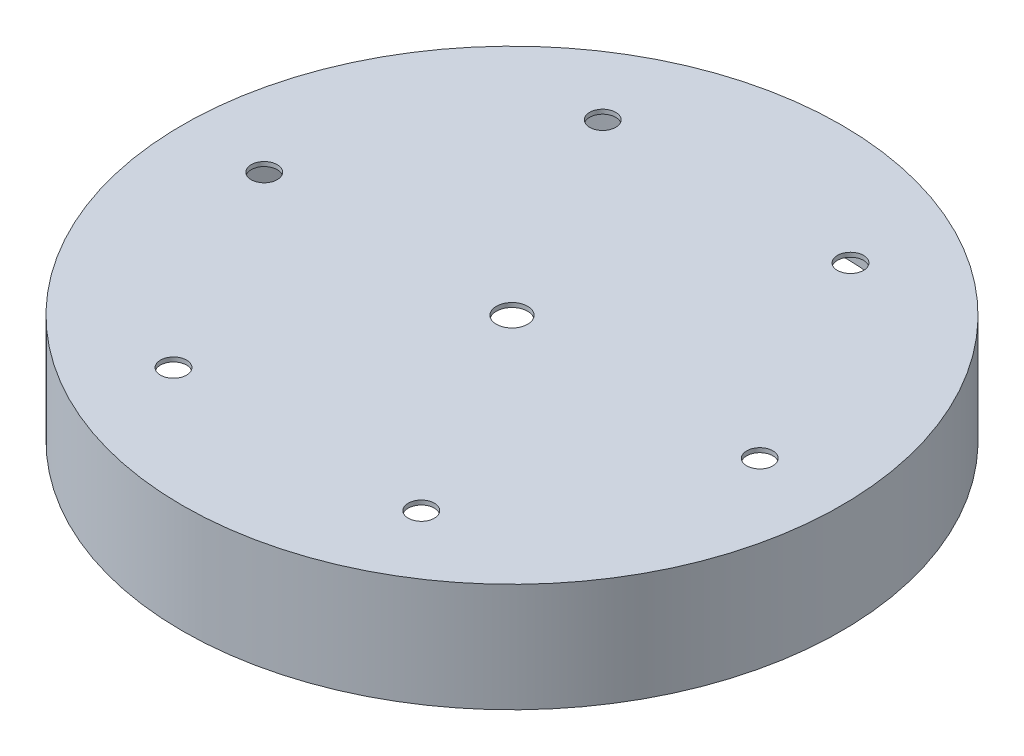
ISO-10303-21;
HEADER;
FILE_DESCRIPTION(('STEP AP214'),'2;1');
FILE_NAME('part.step','',(''),(''),'','','');
FILE_SCHEMA(('AUTOMOTIVE_DESIGN { 1 0 10303 214 1 1 1 1 }'));
ENDSEC;
DATA;
#1=APPLICATION_CONTEXT('core data for automotive mechanical design processes');
#2=APPLICATION_PROTOCOL_DEFINITION('international standard','automotive_design',2000,#1);
#3=PRODUCT_CONTEXT('',#1,'mechanical');
#4=PRODUCT('Part','Part','',(#3));
#5=PRODUCT_RELATED_PRODUCT_CATEGORY('part','',(#4));
#6=PRODUCT_DEFINITION_FORMATION('','',#4);
#7=PRODUCT_DEFINITION_CONTEXT('part definition',#1,'design');
#8=PRODUCT_DEFINITION('design','',#6,#7);
#9=PRODUCT_DEFINITION_SHAPE('','',#8);
#10=(LENGTH_UNIT() NAMED_UNIT(*) SI_UNIT(.MILLI.,.METRE.));
#11=(NAMED_UNIT(*) PLANE_ANGLE_UNIT() SI_UNIT($,.RADIAN.));
#12=(NAMED_UNIT(*) SI_UNIT($,.STERADIAN.) SOLID_ANGLE_UNIT());
#13=UNCERTAINTY_MEASURE_WITH_UNIT(LENGTH_MEASURE(1.E-05),#10,'distance_accuracy_value','');
#14=(GEOMETRIC_REPRESENTATION_CONTEXT(3) GLOBAL_UNCERTAINTY_ASSIGNED_CONTEXT((#13)) GLOBAL_UNIT_ASSIGNED_CONTEXT((#10,
#11,#12)) REPRESENTATION_CONTEXT('',''));
#15=CARTESIAN_POINT('',(0.,0.,0.));
#16=DIRECTION('',(0.,0.,1.));
#17=DIRECTION('',(1.,0.,0.));
#18=AXIS2_PLACEMENT_3D('',#15,#16,#17);
#19=CARTESIAN_POINT('',(0.,31.75,0.));
#20=DIRECTION('',(0.,-1.,0.));
#21=DIRECTION('',(0.,0.,-1.));
#22=AXIS2_PLACEMENT_3D('',#19,#20,#21);
#23=CYLINDRICAL_SURFACE('',#22,96.266);
#24=CARTESIAN_POINT('',(0.,31.75,0.));
#25=DIRECTION('',(0.,1.,0.));
#26=DIRECTION('',(0.,0.,1.));
#27=AXIS2_PLACEMENT_3D('',#24,#25,#26);
#28=CIRCLE('',#27,96.266);
#29=CARTESIAN_POINT('',(0.,31.75,96.266));
#30=VERTEX_POINT('',#29);
#31=EDGE_CURVE('E10',#30,#30,#28,.T.);
#32=ORIENTED_EDGE('',*,*,#31,.F.);
#33=EDGE_LOOP('',(#32));
#34=FACE_BOUND('',#33,.T.);
#35=CARTESIAN_POINT('',(0.,0.,0.));
#36=DIRECTION('',(0.,1.,0.));
#37=DIRECTION('',(0.,0.,1.));
#38=AXIS2_PLACEMENT_3D('',#35,#36,#37);
#39=CIRCLE('',#38,96.266);
#40=CARTESIAN_POINT('',(0.,0.,96.266));
#41=VERTEX_POINT('',#40);
#42=EDGE_CURVE('E38',#41,#41,#39,.T.);
#43=ORIENTED_EDGE('',*,*,#42,.T.);
#44=EDGE_LOOP('',(#43));
#45=FACE_BOUND('',#44,.T.);
#46=ADVANCED_FACE('F31',(#34,#45),#23,.T.);
#47=CARTESIAN_POINT('',(0.,31.75,0.));
#48=DIRECTION('',(0.,1.,0.));
#49=DIRECTION('',(0.,0.,1.));
#50=AXIS2_PLACEMENT_3D('',#47,#48,#49);
#51=PLANE('',#50);
#52=CARTESIAN_POINT('',(72.3821248370096,31.75,-2.03081109092303E-12));
#53=DIRECTION('',(0.,1.,0.));
#54=DIRECTION('',(0.,0.,1.));
#55=AXIS2_PLACEMENT_3D('',#52,#53,#54);
#56=CIRCLE('',#55,3.81000000000073);
#57=CARTESIAN_POINT('',(72.3821248370096,31.75,3.8099999999987));
#58=VERTEX_POINT('',#57);
#59=EDGE_CURVE('E53',#58,#58,#56,.T.);
#60=ORIENTED_EDGE('',*,*,#59,.F.);
#61=EDGE_LOOP('',(#60));
#62=FACE_BOUND('',#61,.T.);
#63=CARTESIAN_POINT('',(36.1910624185041,31.75,62.684758888746));
#64=DIRECTION('',(0.,1.,0.));
#65=DIRECTION('',(0.,0.,1.));
#66=AXIS2_PLACEMENT_3D('',#63,#64,#65);
#67=CIRCLE('',#66,3.80999999999896);
#68=CARTESIAN_POINT('',(36.1910624185041,31.75,66.4947588887449));
#69=VERTEX_POINT('',#68);
#70=EDGE_CURVE('E148',#69,#69,#67,.T.);
#71=ORIENTED_EDGE('',*,*,#70,.F.);
#72=EDGE_LOOP('',(#71));
#73=FACE_BOUND('',#72,.T.);
#74=CARTESIAN_POINT('',(-36.1910624185056,31.75,62.6847588887465));
#75=DIRECTION('',(0.,1.,0.));
#76=DIRECTION('',(0.,0.,1.));
#77=AXIS2_PLACEMENT_3D('',#74,#75,#76);
#78=CIRCLE('',#77,3.81);
#79=CARTESIAN_POINT('',(-36.1910624185056,31.75,66.4947588887465));
#80=VERTEX_POINT('',#79);
#81=EDGE_CURVE('E77',#80,#80,#78,.T.);
#82=ORIENTED_EDGE('',*,*,#81,.F.);
#83=EDGE_LOOP('',(#82));
#84=FACE_BOUND('',#83,.T.);
#85=CARTESIAN_POINT('',(-72.3821248370104,31.75,-1.71390679426509E-12));
#86=DIRECTION('',(0.,1.,0.));
#87=DIRECTION('',(0.,0.,1.));
#88=AXIS2_PLACEMENT_3D('',#85,#86,#87);
#89=CIRCLE('',#88,3.81000000000016);
#90=CARTESIAN_POINT('',(-72.3821248370104,31.75,3.80999999999845));
#91=VERTEX_POINT('',#90);
#92=EDGE_CURVE('E152',#91,#91,#89,.T.);
#93=ORIENTED_EDGE('',*,*,#92,.F.);
#94=EDGE_LOOP('',(#93));
#95=FACE_BOUND('',#94,.T.);
#96=CARTESIAN_POINT('',(-36.1910624185062,31.75,-62.6847588887486));
#97=DIRECTION('',(0.,1.,0.));
#98=DIRECTION('',(0.,0.,1.));
#99=AXIS2_PLACEMENT_3D('',#96,#97,#98);
#100=CIRCLE('',#99,3.81000000000217);
#101=CARTESIAN_POINT('',(-36.1910624185062,31.75,-58.8747588887464));
#102=VERTEX_POINT('',#101);
#103=EDGE_CURVE('E145',#102,#102,#100,.T.);
#104=ORIENTED_EDGE('',*,*,#103,.F.);
#105=EDGE_LOOP('',(#104));
#106=FACE_BOUND('',#105,.T.);
#107=CARTESIAN_POINT('',(36.1910624185039,31.75,-62.6847588887484));
#108=DIRECTION('',(0.,1.,0.));
#109=DIRECTION('',(0.,0.,1.));
#110=AXIS2_PLACEMENT_3D('',#107,#108,#109);
#111=CIRCLE('',#110,3.81000000000135);
#112=CARTESIAN_POINT('',(36.1910624185039,31.75,-58.8747588887471));
#113=VERTEX_POINT('',#112);
#114=EDGE_CURVE('E142',#113,#113,#111,.T.);
#115=ORIENTED_EDGE('',*,*,#114,.F.);
#116=EDGE_LOOP('',(#115));
#117=FACE_BOUND('',#116,.T.);
#118=CARTESIAN_POINT('',(1.162989650898E-06,31.75,-2.51670172484532E-06));
#119=DIRECTION('',(0.,1.,0.));
#120=DIRECTION('',(0.,0.,1.));
#121=AXIS2_PLACEMENT_3D('',#118,#119,#120);
#122=CIRCLE('',#121,4.564126);
#123=CARTESIAN_POINT('',(1.162989650898E-06,31.75,4.56412348329828));
#124=VERTEX_POINT('',#123);
#125=EDGE_CURVE('E66',#124,#124,#122,.T.);
#126=ORIENTED_EDGE('',*,*,#125,.F.);
#127=EDGE_LOOP('',(#126));
#128=FACE_BOUND('',#127,.T.);
#129=ORIENTED_EDGE('',*,*,#31,.T.);
#130=EDGE_LOOP('',(#129));
#131=FACE_BOUND('',#130,.T.);
#132=ADVANCED_FACE('F90',(#62,#73,#84,#95,#106,#117,#128,#131),#51,.T.);
#133=CARTESIAN_POINT('',(0.,0.,0.));
#134=DIRECTION('',(0.,1.,0.));
#135=DIRECTION('',(0.,0.,1.));
#136=AXIS2_PLACEMENT_3D('',#133,#134,#135);
#137=PLANE('',#136);
#138=CARTESIAN_POINT('',(0.,0.,0.));
#139=DIRECTION('',(0.,-1.,0.));
#140=DIRECTION('',(0.,0.,-1.));
#141=AXIS2_PLACEMENT_3D('',#138,#139,#140);
#142=CIRCLE('',#141,94.996);
#143=CARTESIAN_POINT('',(0.,0.,-94.996));
#144=VERTEX_POINT('',#143);
#145=EDGE_CURVE('E46',#144,#144,#142,.T.);
#146=ORIENTED_EDGE('',*,*,#145,.F.);
#147=EDGE_LOOP('',(#146));
#148=FACE_BOUND('',#147,.T.);
#149=ORIENTED_EDGE('',*,*,#42,.F.);
#150=EDGE_LOOP('',(#149));
#151=FACE_BOUND('',#150,.T.);
#152=ADVANCED_FACE('F87',(#148,#151),#137,.F.);
#153=CARTESIAN_POINT('',(0.,30.48,0.));
#154=DIRECTION('',(0.,-1.,0.));
#155=DIRECTION('',(0.,0.,-1.));
#156=AXIS2_PLACEMENT_3D('',#153,#154,#155);
#157=CYLINDRICAL_SURFACE('',#156,94.996);
#158=CARTESIAN_POINT('',(0.,30.48,0.));
#159=DIRECTION('',(0.,-1.,0.));
#160=DIRECTION('',(0.,0.,-1.));
#161=AXIS2_PLACEMENT_3D('',#158,#159,#160);
#162=CIRCLE('',#161,94.996);
#163=CARTESIAN_POINT('',(0.,30.48,-94.996));
#164=VERTEX_POINT('',#163);
#165=EDGE_CURVE('E43',#164,#164,#162,.T.);
#166=CARTESIAN_POINT('',(0.,30.48,-94.996));
#167=CARTESIAN_POINT('',(0.,30.1625,-94.996));
#168=CARTESIAN_POINT('',(0.,29.845,-94.996));
#169=CARTESIAN_POINT('',(0.,29.21,-94.996));
#170=CARTESIAN_POINT('',(0.,28.8925,-94.996));
#171=CARTESIAN_POINT('',(0.,28.2575,-94.996));
#172=CARTESIAN_POINT('',(0.,27.94,-94.996));
#173=CARTESIAN_POINT('',(0.,27.305,-94.996));
#174=CARTESIAN_POINT('',(0.,26.9875,-94.996));
#175=CARTESIAN_POINT('',(0.,26.3525,-94.996));
#176=CARTESIAN_POINT('',(0.,26.035,-94.996));
#177=CARTESIAN_POINT('',(0.,25.4,-94.996));
#178=CARTESIAN_POINT('',(0.,25.0825,-94.996));
#179=CARTESIAN_POINT('',(0.,24.4475,-94.996));
#180=CARTESIAN_POINT('',(0.,24.13,-94.996));
#181=CARTESIAN_POINT('',(0.,23.495,-94.996));
#182=CARTESIAN_POINT('',(0.,23.1775,-94.996));
#183=CARTESIAN_POINT('',(0.,22.5425,-94.996));
#184=CARTESIAN_POINT('',(0.,22.225,-94.996));
#185=CARTESIAN_POINT('',(0.,21.59,-94.996));
#186=CARTESIAN_POINT('',(0.,21.2725,-94.996));
#187=CARTESIAN_POINT('',(0.,20.6375,-94.996));
#188=CARTESIAN_POINT('',(0.,20.32,-94.996));
#189=CARTESIAN_POINT('',(0.,19.685,-94.996));
#190=CARTESIAN_POINT('',(0.,19.3675,-94.996));
#191=CARTESIAN_POINT('',(0.,18.7325,-94.996));
#192=CARTESIAN_POINT('',(0.,18.415,-94.996));
#193=CARTESIAN_POINT('',(0.,17.78,-94.996));
#194=CARTESIAN_POINT('',(0.,17.4625,-94.996));
#195=CARTESIAN_POINT('',(0.,16.8275,-94.996));
#196=CARTESIAN_POINT('',(0.,16.51,-94.996));
#197=CARTESIAN_POINT('',(0.,15.875,-94.996));
#198=CARTESIAN_POINT('',(0.,15.5575,-94.996));
#199=CARTESIAN_POINT('',(0.,14.9225,-94.996));
#200=CARTESIAN_POINT('',(0.,14.605,-94.996));
#201=CARTESIAN_POINT('',(0.,13.97,-94.996));
#202=CARTESIAN_POINT('',(0.,13.6525,-94.996));
#203=CARTESIAN_POINT('',(0.,13.0175,-94.996));
#204=CARTESIAN_POINT('',(0.,12.7,-94.996));
#205=CARTESIAN_POINT('',(0.,12.065,-94.996));
#206=CARTESIAN_POINT('',(0.,11.7475,-94.996));
#207=CARTESIAN_POINT('',(0.,11.1125,-94.996));
#208=CARTESIAN_POINT('',(0.,10.795,-94.996));
#209=CARTESIAN_POINT('',(0.,10.16,-94.996));
#210=CARTESIAN_POINT('',(0.,9.8425,-94.996));
#211=CARTESIAN_POINT('',(0.,9.2075,-94.996));
#212=CARTESIAN_POINT('',(0.,8.89,-94.996));
#213=CARTESIAN_POINT('',(0.,8.255,-94.996));
#214=CARTESIAN_POINT('',(0.,7.9375,-94.996));
#215=CARTESIAN_POINT('',(0.,7.3025,-94.996));
#216=CARTESIAN_POINT('',(0.,6.985,-94.996));
#217=CARTESIAN_POINT('',(0.,6.35,-94.996));
#218=CARTESIAN_POINT('',(0.,6.0325,-94.996));
#219=CARTESIAN_POINT('',(0.,5.3975,-94.996));
#220=CARTESIAN_POINT('',(0.,5.08,-94.996));
#221=CARTESIAN_POINT('',(0.,4.445,-94.996));
#222=CARTESIAN_POINT('',(0.,4.1275,-94.996));
#223=CARTESIAN_POINT('',(0.,3.4925,-94.996));
#224=CARTESIAN_POINT('',(0.,3.175,-94.996));
#225=CARTESIAN_POINT('',(0.,2.54,-94.996));
#226=CARTESIAN_POINT('',(0.,2.2225,-94.996));
#227=CARTESIAN_POINT('',(0.,1.5875,-94.996));
#228=CARTESIAN_POINT('',(0.,1.27,-94.996));
#229=CARTESIAN_POINT('',(0.,0.634999999999999,-94.996));
#230=CARTESIAN_POINT('',(0.,0.3175,-94.996));
#231=CARTESIAN_POINT('',(0.,0.,-94.996));
#232=B_SPLINE_CURVE_WITH_KNOTS('',3,(#166,#167,#168,#169,#170,#171,#172,#173,#174,#175,#176,
#177,#178,#179,#180,#181,#182,#183,#184,#185,#186,#187,#188,#189,#190,#191,#192,#193,#194,#195,
#196,#197,#198,#199,#200,#201,#202,#203,#204,#205,#206,#207,#208,#209,#210,#211,#212,#213,#214,
#215,#216,#217,#218,#219,#220,#221,#222,#223,#224,#225,#226,#227,#228,#229,#230,#231),
.UNSPECIFIED.,.F.,.F.,(4,2,2,2,2,2,2,2,2,2,2,2,2,2,2,2,2,2,2,2,2,2,2,2,2,2,2,2,2,2,2,2,4),(0.,
0.952500000000002,1.905,2.8575,3.81,4.7625,5.715,6.6675,7.62,8.5725,9.525,10.4775,11.43,12.3825,
13.335,14.2875,15.24,16.1925,17.145,18.0975,19.05,20.0025,20.955,21.9075,22.86,23.8125,24.765,
25.7175,26.67,27.6225,28.575,29.5275,30.48),.UNSPECIFIED.);
#233=EDGE_CURVE('BSEAM85',#164,#144,#232,.T.);
#234=ORIENTED_EDGE('',*,*,#165,.F.);
#235=ORIENTED_EDGE('',*,*,#145,.T.);
#236=ORIENTED_EDGE('',*,*,#233,.T.);
#237=ORIENTED_EDGE('',*,*,#233,.F.);
#238=EDGE_LOOP('',(#234,#236,#235,#237));
#239=FACE_BOUND('',#238,.T.);
#240=ADVANCED_FACE('F85',(#239),#157,.F.);
#241=CARTESIAN_POINT('',(0.,30.48,0.));
#242=DIRECTION('',(0.,-1.,0.));
#243=DIRECTION('',(0.,0.,-1.));
#244=AXIS2_PLACEMENT_3D('',#241,#242,#243);
#245=PLANE('',#244);
#246=CARTESIAN_POINT('',(72.3821248370096,30.48,-2.03081109092303E-12));
#247=DIRECTION('',(0.,-1.,0.));
#248=DIRECTION('',(0.,0.,-1.));
#249=AXIS2_PLACEMENT_3D('',#246,#247,#248);
#250=CIRCLE('',#249,3.81000000000073);
#251=CARTESIAN_POINT('',(72.3821248370096,30.48,-3.81000000000276));
#252=VERTEX_POINT('',#251);
#253=EDGE_CURVE('E34',#252,#252,#250,.T.);
#254=ORIENTED_EDGE('',*,*,#253,.F.);
#255=EDGE_LOOP('',(#254));
#256=FACE_BOUND('',#255,.T.);
#257=CARTESIAN_POINT('',(36.1910624185041,30.48,62.684758888746));
#258=DIRECTION('',(0.,-1.,0.));
#259=DIRECTION('',(0.,0.,-1.));
#260=AXIS2_PLACEMENT_3D('',#257,#258,#259);
#261=CIRCLE('',#260,3.80999999999896);
#262=CARTESIAN_POINT('',(36.1910624185041,30.48,58.874758888747));
#263=VERTEX_POINT('',#262);
#264=EDGE_CURVE('E61',#263,#263,#261,.T.);
#265=ORIENTED_EDGE('',*,*,#264,.F.);
#266=EDGE_LOOP('',(#265));
#267=FACE_BOUND('',#266,.T.);
#268=CARTESIAN_POINT('',(-36.1910624185056,30.48,62.6847588887465));
#269=DIRECTION('',(0.,-1.,0.));
#270=DIRECTION('',(0.,0.,-1.));
#271=AXIS2_PLACEMENT_3D('',#268,#269,#270);
#272=CIRCLE('',#271,3.81);
#273=CARTESIAN_POINT('',(-36.1910624185056,30.48,58.8747588887465));
#274=VERTEX_POINT('',#273);
#275=EDGE_CURVE('E59',#274,#274,#272,.T.);
#276=ORIENTED_EDGE('',*,*,#275,.F.);
#277=EDGE_LOOP('',(#276));
#278=FACE_BOUND('',#277,.T.);
#279=CARTESIAN_POINT('',(-72.3821248370104,30.48,-1.71390679426509E-12));
#280=DIRECTION('',(0.,-1.,0.));
#281=DIRECTION('',(0.,0.,-1.));
#282=AXIS2_PLACEMENT_3D('',#279,#280,#281);
#283=CIRCLE('',#282,3.81000000000016);
#284=CARTESIAN_POINT('',(-72.3821248370104,30.48,-3.81000000000188));
#285=VERTEX_POINT('',#284);
#286=EDGE_CURVE('E56',#285,#285,#283,.T.);
#287=ORIENTED_EDGE('',*,*,#286,.F.);
#288=EDGE_LOOP('',(#287));
#289=FACE_BOUND('',#288,.T.);
#290=CARTESIAN_POINT('',(-36.1910624185062,30.48,-62.6847588887486));
#291=DIRECTION('',(0.,-1.,0.));
#292=DIRECTION('',(0.,0.,-1.));
#293=AXIS2_PLACEMENT_3D('',#290,#291,#292);
#294=CIRCLE('',#293,3.81000000000217);
#295=CARTESIAN_POINT('',(-36.1910624185062,30.48,-66.4947588887508));
#296=VERTEX_POINT('',#295);
#297=EDGE_CURVE('E52',#296,#296,#294,.T.);
#298=ORIENTED_EDGE('',*,*,#297,.F.);
#299=EDGE_LOOP('',(#298));
#300=FACE_BOUND('',#299,.T.);
#301=CARTESIAN_POINT('',(36.1910624185039,30.48,-62.6847588887484));
#302=DIRECTION('',(0.,-1.,0.));
#303=DIRECTION('',(0.,0.,-1.));
#304=AXIS2_PLACEMENT_3D('',#301,#302,#303);
#305=CIRCLE('',#304,3.81000000000135);
#306=CARTESIAN_POINT('',(36.1910624185039,30.48,-66.4947588887498));
#307=VERTEX_POINT('',#306);
#308=EDGE_CURVE('E49',#307,#307,#305,.T.);
#309=ORIENTED_EDGE('',*,*,#308,.F.);
#310=EDGE_LOOP('',(#309));
#311=FACE_BOUND('',#310,.T.);
#312=CARTESIAN_POINT('',(1.162989650898E-06,30.48,-2.51670172484532E-06));
#313=DIRECTION('',(0.,-1.,0.));
#314=DIRECTION('',(0.,0.,-1.));
#315=AXIS2_PLACEMENT_3D('',#312,#313,#314);
#316=CIRCLE('',#315,4.564126);
#317=CARTESIAN_POINT('',(1.162989650898E-06,30.48,-4.56412851670172));
#318=VERTEX_POINT('',#317);
#319=EDGE_CURVE('E70',#318,#318,#316,.T.);
#320=ORIENTED_EDGE('',*,*,#319,.F.);
#321=EDGE_LOOP('',(#320));
#322=FACE_BOUND('',#321,.T.);
#323=ORIENTED_EDGE('',*,*,#165,.T.);
#324=EDGE_LOOP('',(#323));
#325=FACE_BOUND('',#324,.T.);
#326=ADVANCED_FACE('F109',(#256,#267,#278,#289,#300,#311,#322,#325),#245,.T.);
#327=CARTESIAN_POINT('',(1.162989650898E-06,31.75,-2.51670172484532E-06));
#328=DIRECTION('',(0.,1.,0.));
#329=DIRECTION('',(0.,0.,1.));
#330=AXIS2_PLACEMENT_3D('',#327,#328,#329);
#331=CYLINDRICAL_SURFACE('',#330,4.564126);
#332=ORIENTED_EDGE('',*,*,#319,.T.);
#333=EDGE_LOOP('',(#332));
#334=FACE_BOUND('',#333,.T.);
#335=ORIENTED_EDGE('',*,*,#125,.T.);
#336=EDGE_LOOP('',(#335));
#337=FACE_BOUND('',#336,.T.);
#338=ADVANCED_FACE('F112',(#334,#337),#331,.F.);
#339=CARTESIAN_POINT('',(36.1910624185039,8.89,-62.6847588887484));
#340=DIRECTION('',(0.,1.,0.));
#341=DIRECTION('',(0.,0.,1.));
#342=AXIS2_PLACEMENT_3D('',#339,#340,#341);
#343=CYLINDRICAL_SURFACE('',#342,3.81000000000135);
#344=ORIENTED_EDGE('',*,*,#308,.T.);
#345=EDGE_LOOP('',(#344));
#346=FACE_BOUND('',#345,.T.);
#347=ORIENTED_EDGE('',*,*,#114,.T.);
#348=EDGE_LOOP('',(#347));
#349=FACE_BOUND('',#348,.T.);
#350=ADVANCED_FACE('F116',(#346,#349),#343,.F.);
#351=CARTESIAN_POINT('',(-36.1910624185062,8.89,-62.6847588887486));
#352=DIRECTION('',(0.,1.,0.));
#353=DIRECTION('',(0.,0.,1.));
#354=AXIS2_PLACEMENT_3D('',#351,#352,#353);
#355=CYLINDRICAL_SURFACE('',#354,3.81000000000217);
#356=ORIENTED_EDGE('',*,*,#297,.T.);
#357=EDGE_LOOP('',(#356));
#358=FACE_BOUND('',#357,.T.);
#359=ORIENTED_EDGE('',*,*,#103,.T.);
#360=EDGE_LOOP('',(#359));
#361=FACE_BOUND('',#360,.T.);
#362=ADVANCED_FACE('F126',(#358,#361),#355,.F.);
#363=CARTESIAN_POINT('',(-72.3821248370104,8.89,-1.71390679426509E-12));
#364=DIRECTION('',(0.,1.,0.));
#365=DIRECTION('',(0.,0.,1.));
#366=AXIS2_PLACEMENT_3D('',#363,#364,#365);
#367=CYLINDRICAL_SURFACE('',#366,3.81000000000016);
#368=ORIENTED_EDGE('',*,*,#286,.T.);
#369=EDGE_LOOP('',(#368));
#370=FACE_BOUND('',#369,.T.);
#371=ORIENTED_EDGE('',*,*,#92,.T.);
#372=EDGE_LOOP('',(#371));
#373=FACE_BOUND('',#372,.T.);
#374=ADVANCED_FACE('F122',(#370,#373),#367,.F.);
#375=CARTESIAN_POINT('',(-36.1910624185056,8.89,62.6847588887465));
#376=DIRECTION('',(0.,1.,0.));
#377=DIRECTION('',(0.,0.,1.));
#378=AXIS2_PLACEMENT_3D('',#375,#376,#377);
#379=CYLINDRICAL_SURFACE('',#378,3.81);
#380=ORIENTED_EDGE('',*,*,#275,.T.);
#381=EDGE_LOOP('',(#380));
#382=FACE_BOUND('',#381,.T.);
#383=ORIENTED_EDGE('',*,*,#81,.T.);
#384=EDGE_LOOP('',(#383));
#385=FACE_BOUND('',#384,.T.);
#386=ADVANCED_FACE('F118',(#382,#385),#379,.F.);
#387=CARTESIAN_POINT('',(36.1910624185041,8.89,62.684758888746));
#388=DIRECTION('',(0.,1.,0.));
#389=DIRECTION('',(0.,0.,1.));
#390=AXIS2_PLACEMENT_3D('',#387,#388,#389);
#391=CYLINDRICAL_SURFACE('',#390,3.80999999999896);
#392=ORIENTED_EDGE('',*,*,#264,.T.);
#393=EDGE_LOOP('',(#392));
#394=FACE_BOUND('',#393,.T.);
#395=ORIENTED_EDGE('',*,*,#70,.T.);
#396=EDGE_LOOP('',(#395));
#397=FACE_BOUND('',#396,.T.);
#398=ADVANCED_FACE('F121',(#394,#397),#391,.F.);
#399=CARTESIAN_POINT('',(72.3821248370096,8.89,-2.03081109092303E-12));
#400=DIRECTION('',(0.,1.,0.));
#401=DIRECTION('',(0.,0.,1.));
#402=AXIS2_PLACEMENT_3D('',#399,#400,#401);
#403=CYLINDRICAL_SURFACE('',#402,3.81000000000073);
#404=ORIENTED_EDGE('',*,*,#253,.T.);
#405=EDGE_LOOP('',(#404));
#406=FACE_BOUND('',#405,.T.);
#407=ORIENTED_EDGE('',*,*,#59,.T.);
#408=EDGE_LOOP('',(#407));
#409=FACE_BOUND('',#408,.T.);
#410=ADVANCED_FACE('F136',(#406,#409),#403,.F.);
#411=CLOSED_SHELL('',(#46,#132,#152,#240,#326,#338,#350,#362,#374,#386,#398,#410));
#412=MANIFOLD_SOLID_BREP('B2',#411);
#413=ADVANCED_BREP_SHAPE_REPRESENTATION('',(#18,#412),#14);
#414=SHAPE_DEFINITION_REPRESENTATION(#9,#413);
ENDSEC;
END-ISO-10303-21;
